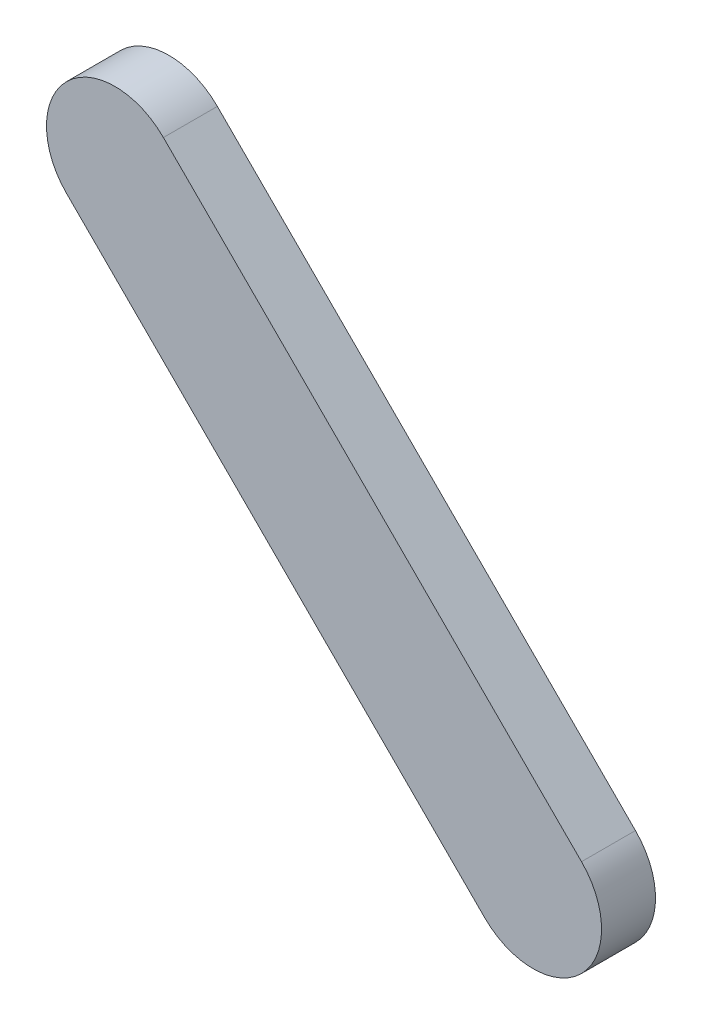
ISO-10303-21;
HEADER;
FILE_DESCRIPTION(('STEP AP214'),'2;1');
FILE_NAME('part.step','',(''),(''),'','','');
FILE_SCHEMA(('AUTOMOTIVE_DESIGN { 1 0 10303 214 1 1 1 1 }'));
ENDSEC;
DATA;
#1=APPLICATION_CONTEXT('core data for automotive mechanical design processes');
#2=APPLICATION_PROTOCOL_DEFINITION('international standard','automotive_design',2000,#1);
#3=PRODUCT_CONTEXT('',#1,'mechanical');
#4=PRODUCT('Part','Part','',(#3));
#5=PRODUCT_RELATED_PRODUCT_CATEGORY('part','',(#4));
#6=PRODUCT_DEFINITION_FORMATION('','',#4);
#7=PRODUCT_DEFINITION_CONTEXT('part definition',#1,'design');
#8=PRODUCT_DEFINITION('design','',#6,#7);
#9=PRODUCT_DEFINITION_SHAPE('','',#8);
#10=(LENGTH_UNIT() NAMED_UNIT(*) SI_UNIT(.MILLI.,.METRE.));
#11=(NAMED_UNIT(*) PLANE_ANGLE_UNIT() SI_UNIT($,.RADIAN.));
#12=(NAMED_UNIT(*) SI_UNIT($,.STERADIAN.) SOLID_ANGLE_UNIT());
#13=UNCERTAINTY_MEASURE_WITH_UNIT(LENGTH_MEASURE(1.E-05),#10,'distance_accuracy_value','');
#14=(GEOMETRIC_REPRESENTATION_CONTEXT(3) GLOBAL_UNCERTAINTY_ASSIGNED_CONTEXT((#13)) GLOBAL_UNIT_ASSIGNED_CONTEXT((#10,
#11,#12)) REPRESENTATION_CONTEXT('',''));
#15=CARTESIAN_POINT('',(0.,0.,0.));
#16=DIRECTION('',(0.,0.,1.));
#17=DIRECTION('',(1.,0.,0.));
#18=AXIS2_PLACEMENT_3D('',#15,#16,#17);
#19=CARTESIAN_POINT('',(91.5708862,66.14091166,0.));
#20=DIRECTION('',(0.707106781186544,0.707106781186551,0.));
#21=DIRECTION('',(0.707106781186551,-0.707106781186544,0.));
#22=AXIS2_PLACEMENT_3D('',#19,#20,#21);
#23=PLANE('',#22);
#24=DIRECTION('',(0.707106781186551,-0.707106781186544,0.));
#25=VECTOR('',#24,1.);
#26=CARTESIAN_POINT('',(91.5708862,66.14091166,0.1999996));
#27=LINE('',#26,#25);
#28=CARTESIAN_POINT('',(91.5708862,66.14091166,0.1999996));
#29=VERTEX_POINT('',#28);
#30=CARTESIAN_POINT('',(93.12140126,64.5903966,0.1999996));
#31=VERTEX_POINT('',#30);
#32=EDGE_CURVE('E11',#29,#31,#27,.T.);
#33=ORIENTED_EDGE('',*,*,#32,.F.);
#34=DIRECTION('',(0.,0.,1.));
#35=VECTOR('',#34,1.);
#36=CARTESIAN_POINT('',(91.5708862,66.14091166,0.));
#37=LINE('',#36,#35);
#38=CARTESIAN_POINT('',(91.5708862,66.14091166,0.));
#39=VERTEX_POINT('',#38);
#40=EDGE_CURVE('E24',#39,#29,#37,.T.);
#41=ORIENTED_EDGE('',*,*,#40,.F.);
#42=DIRECTION('',(0.707106781186551,-0.707106781186544,0.));
#43=VECTOR('',#42,1.);
#44=CARTESIAN_POINT('',(91.5708862,66.14091166,0.));
#45=LINE('',#44,#43);
#46=CARTESIAN_POINT('',(93.12140126,64.5903966,0.));
#47=VERTEX_POINT('',#46);
#48=EDGE_CURVE('E75',#39,#47,#45,.T.);
#49=ORIENTED_EDGE('',*,*,#48,.T.);
#50=DIRECTION('',(0.,0.,1.));
#51=VECTOR('',#50,1.);
#52=CARTESIAN_POINT('',(93.12140126,64.5903966,0.));
#53=LINE('',#52,#51);
#54=EDGE_CURVE('E37',#47,#31,#53,.T.);
#55=ORIENTED_EDGE('',*,*,#54,.T.);
#56=EDGE_LOOP('',(#33,#41,#49,#55));
#57=FACE_BOUND('',#56,.T.);
#58=ADVANCED_FACE('F17',(#57),#23,.F.);
#59=CARTESIAN_POINT('',(93.30100593,64.77000127,0.));
#60=DIRECTION('',(0.,0.,-1.));
#61=DIRECTION('',(-0.707106781186576,-0.70710678118652,0.));
#62=AXIS2_PLACEMENT_3D('',#59,#60,#61);
#63=CYLINDRICAL_SURFACE('',#62,0.253999360179536);
#64=CARTESIAN_POINT('',(93.30100593,64.77000127,0.1999996));
#65=DIRECTION('',(0.,0.,1.));
#66=DIRECTION('',(-0.707106781186576,-0.70710678118652,0.));
#67=AXIS2_PLACEMENT_3D('',#64,#65,#66);
#68=CIRCLE('',#67,0.253999360179536);
#69=CARTESIAN_POINT('',(93.4806106,64.94960594,0.1999996));
#70=VERTEX_POINT('',#69);
#71=EDGE_CURVE('E83',#31,#70,#68,.T.);
#72=ORIENTED_EDGE('',*,*,#71,.F.);
#73=ORIENTED_EDGE('',*,*,#54,.F.);
#74=CARTESIAN_POINT('',(93.30100593,64.77000127,0.));
#75=DIRECTION('',(0.,0.,1.));
#76=DIRECTION('',(-0.707106781186576,-0.70710678118652,0.));
#77=AXIS2_PLACEMENT_3D('',#74,#75,#76);
#78=CIRCLE('',#77,0.253999360179536);
#79=CARTESIAN_POINT('',(93.4806106,64.94960594,0.));
#80=VERTEX_POINT('',#79);
#81=EDGE_CURVE('E81',#47,#80,#78,.T.);
#82=ORIENTED_EDGE('',*,*,#81,.T.);
#83=DIRECTION('',(0.,0.,1.));
#84=VECTOR('',#83,1.);
#85=CARTESIAN_POINT('',(93.4806106,64.94960594,0.));
#86=LINE('',#85,#84);
#87=EDGE_CURVE('E67',#80,#70,#86,.T.);
#88=ORIENTED_EDGE('',*,*,#87,.T.);
#89=EDGE_LOOP('',(#72,#73,#82,#88));
#90=FACE_BOUND('',#89,.T.);
#91=ADVANCED_FACE('F89',(#90),#63,.T.);
#92=CARTESIAN_POINT('',(93.4806106,64.94960594,0.));
#93=DIRECTION('',(-0.707106781186548,-0.707106781186548,0.));
#94=DIRECTION('',(-0.707106781186548,0.707106781186548,0.));
#95=AXIS2_PLACEMENT_3D('',#92,#93,#94);
#96=PLANE('',#95);
#97=DIRECTION('',(-0.707106781186548,0.707106781186548,0.));
#98=VECTOR('',#97,1.);
#99=CARTESIAN_POINT('',(93.4806106,64.94960594,0.1999996));
#100=LINE('',#99,#98);
#101=CARTESIAN_POINT('',(91.93009554,66.500121,0.1999996));
#102=VERTEX_POINT('',#101);
#103=EDGE_CURVE('E71',#70,#102,#100,.T.);
#104=ORIENTED_EDGE('',*,*,#103,.F.);
#105=ORIENTED_EDGE('',*,*,#87,.F.);
#106=DIRECTION('',(-0.707106781186548,0.707106781186548,0.));
#107=VECTOR('',#106,1.);
#108=CARTESIAN_POINT('',(93.4806106,64.94960594,0.));
#109=LINE('',#108,#107);
#110=CARTESIAN_POINT('',(91.93009554,66.500121,0.));
#111=VERTEX_POINT('',#110);
#112=EDGE_CURVE('E63',#80,#111,#109,.T.);
#113=ORIENTED_EDGE('',*,*,#112,.T.);
#114=DIRECTION('',(0.,0.,1.));
#115=VECTOR('',#114,1.);
#116=CARTESIAN_POINT('',(91.93009554,66.500121,0.));
#117=LINE('',#116,#115);
#118=EDGE_CURVE('E53',#111,#102,#117,.T.);
#119=ORIENTED_EDGE('',*,*,#118,.T.);
#120=EDGE_LOOP('',(#104,#105,#113,#119));
#121=FACE_BOUND('',#120,.T.);
#122=ADVANCED_FACE('F66',(#121),#96,.F.);
#123=CARTESIAN_POINT('',(91.75049087,66.32051633,0.));
#124=DIRECTION('',(0.,0.,-1.));
#125=DIRECTION('',(0.707106781186576,0.70710678118652,0.));
#126=AXIS2_PLACEMENT_3D('',#123,#124,#125);
#127=CYLINDRICAL_SURFACE('',#126,0.253999360179542);
#128=CARTESIAN_POINT('',(91.75049087,66.32051633,0.1999996));
#129=DIRECTION('',(0.,0.,1.));
#130=DIRECTION('',(0.707106781186576,0.70710678118652,0.));
#131=AXIS2_PLACEMENT_3D('',#128,#129,#130);
#132=CIRCLE('',#131,0.253999360179542);
#133=EDGE_CURVE('E59',#102,#29,#132,.T.);
#134=ORIENTED_EDGE('',*,*,#133,.F.);
#135=ORIENTED_EDGE('',*,*,#118,.F.);
#136=CARTESIAN_POINT('',(91.75049087,66.32051633,0.));
#137=DIRECTION('',(0.,0.,1.));
#138=DIRECTION('',(0.707106781186576,0.70710678118652,0.));
#139=AXIS2_PLACEMENT_3D('',#136,#137,#138);
#140=CIRCLE('',#139,0.253999360179542);
#141=EDGE_CURVE('E57',#111,#39,#140,.T.);
#142=ORIENTED_EDGE('',*,*,#141,.T.);
#143=ORIENTED_EDGE('',*,*,#40,.T.);
#144=EDGE_LOOP('',(#134,#135,#142,#143));
#145=FACE_BOUND('',#144,.T.);
#146=ADVANCED_FACE('F55',(#145),#127,.T.);
#147=CARTESIAN_POINT('',(91.5708862,66.14091166,0.));
#148=DIRECTION('',(0.,0.,-1.));
#149=DIRECTION('',(-1.,0.,0.));
#150=AXIS2_PLACEMENT_3D('',#147,#148,#149);
#151=PLANE('',#150);
#152=ORIENTED_EDGE('',*,*,#141,.F.);
#153=ORIENTED_EDGE('',*,*,#112,.F.);
#154=ORIENTED_EDGE('',*,*,#81,.F.);
#155=ORIENTED_EDGE('',*,*,#48,.F.);
#156=EDGE_LOOP('',(#152,#153,#154,#155));
#157=FACE_BOUND('',#156,.T.);
#158=ADVANCED_FACE('F74',(#157),#151,.T.);
#159=CARTESIAN_POINT('',(91.5708862,66.14091166,0.1999996));
#160=DIRECTION('',(0.,0.,-1.));
#161=DIRECTION('',(-1.,0.,0.));
#162=AXIS2_PLACEMENT_3D('',#159,#160,#161);
#163=PLANE('',#162);
#164=ORIENTED_EDGE('',*,*,#32,.T.);
#165=ORIENTED_EDGE('',*,*,#71,.T.);
#166=ORIENTED_EDGE('',*,*,#103,.T.);
#167=ORIENTED_EDGE('',*,*,#133,.T.);
#168=EDGE_LOOP('',(#164,#165,#166,#167));
#169=FACE_BOUND('',#168,.T.);
#170=ADVANCED_FACE('F91',(#169),#163,.F.);
#171=CLOSED_SHELL('',(#58,#91,#122,#146,#158,#170));
#172=MANIFOLD_SOLID_BREP('B1',#171);
#173=ADVANCED_BREP_SHAPE_REPRESENTATION('',(#18,#172),#14);
#174=SHAPE_DEFINITION_REPRESENTATION(#9,#173);
ENDSEC;
END-ISO-10303-21;
